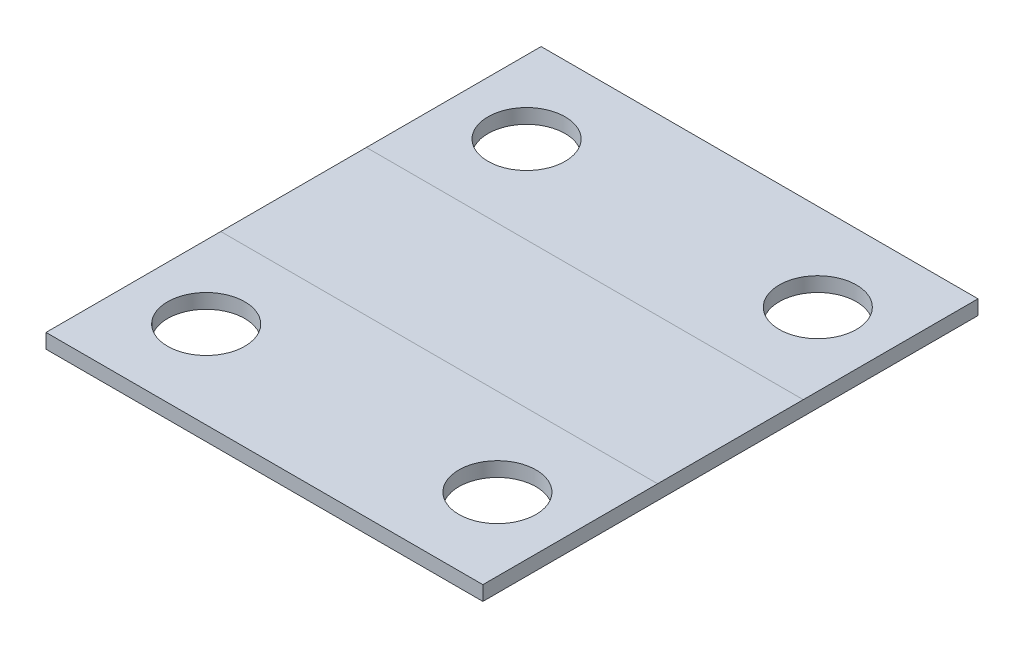
ISO-10303-21;
HEADER;
FILE_DESCRIPTION(('STEP AP214'),'2;1');
FILE_NAME('part.step','',(''),(''),'','','');
FILE_SCHEMA(('AUTOMOTIVE_DESIGN { 1 0 10303 214 1 1 1 1 }'));
ENDSEC;
DATA;
#1=APPLICATION_CONTEXT('core data for automotive mechanical design processes');
#2=APPLICATION_PROTOCOL_DEFINITION('international standard','automotive_design',2000,#1);
#3=PRODUCT_CONTEXT('',#1,'mechanical');
#4=PRODUCT('Part','Part','',(#3));
#5=PRODUCT_RELATED_PRODUCT_CATEGORY('part','',(#4));
#6=PRODUCT_DEFINITION_FORMATION('','',#4);
#7=PRODUCT_DEFINITION_CONTEXT('part definition',#1,'design');
#8=PRODUCT_DEFINITION('design','',#6,#7);
#9=PRODUCT_DEFINITION_SHAPE('','',#8);
#10=(LENGTH_UNIT() NAMED_UNIT(*) SI_UNIT(.MILLI.,.METRE.));
#11=(NAMED_UNIT(*) PLANE_ANGLE_UNIT() SI_UNIT($,.RADIAN.));
#12=(NAMED_UNIT(*) SI_UNIT($,.STERADIAN.) SOLID_ANGLE_UNIT());
#13=UNCERTAINTY_MEASURE_WITH_UNIT(LENGTH_MEASURE(1.E-05),#10,'distance_accuracy_value','');
#14=(GEOMETRIC_REPRESENTATION_CONTEXT(3) GLOBAL_UNCERTAINTY_ASSIGNED_CONTEXT((#13)) GLOBAL_UNIT_ASSIGNED_CONTEXT((#10,
#11,#12)) REPRESENTATION_CONTEXT('',''));
#15=CARTESIAN_POINT('',(0.,0.,0.));
#16=DIRECTION('',(0.,0.,1.));
#17=DIRECTION('',(1.,0.,0.));
#18=AXIS2_PLACEMENT_3D('',#15,#16,#17);
#19=CARTESIAN_POINT('',(0.,-0.5,0.));
#20=DIRECTION('',(0.,-1.,0.));
#21=DIRECTION('',(0.,0.,-1.));
#22=AXIS2_PLACEMENT_3D('',#19,#20,#21);
#23=PLANE('',#22);
#24=CARTESIAN_POINT('',(10.,-0.5,10.9999999999999));
#25=DIRECTION('',(0.,1.,0.));
#26=DIRECTION('',(0.,0.,1.));
#27=AXIS2_PLACEMENT_3D('',#24,#25,#26);
#28=CIRCLE('',#27,2.65);
#29=CARTESIAN_POINT('',(10.,-0.5,13.6499999999998));
#30=VERTEX_POINT('',#29);
#31=EDGE_CURVE('E195',#30,#30,#28,.T.);
#32=ORIENTED_EDGE('',*,*,#31,.T.);
#33=EDGE_LOOP('',(#32));
#34=FACE_BOUND('',#33,.T.);
#35=CARTESIAN_POINT('',(-10.,-0.5,10.9999999999999));
#36=DIRECTION('',(0.,1.,0.));
#37=DIRECTION('',(0.,0.,1.));
#38=AXIS2_PLACEMENT_3D('',#35,#36,#37);
#39=CIRCLE('',#38,2.65);
#40=CARTESIAN_POINT('',(-10.,-0.5,13.6499999999998));
#41=VERTEX_POINT('',#40);
#42=EDGE_CURVE('E201',#41,#41,#39,.T.);
#43=ORIENTED_EDGE('',*,*,#42,.T.);
#44=EDGE_LOOP('',(#43));
#45=FACE_BOUND('',#44,.T.);
#46=DIRECTION('',(0.,0.,1.));
#47=VECTOR('',#46,1.);
#48=CARTESIAN_POINT('',(-15.,-0.5,17.));
#49=LINE('',#48,#47);
#50=CARTESIAN_POINT('',(-15.,-0.5,5.));
#51=VERTEX_POINT('',#50);
#52=CARTESIAN_POINT('',(-15.,-0.5,17.));
#53=VERTEX_POINT('',#52);
#54=EDGE_CURVE('E138',#51,#53,#49,.T.);
#55=ORIENTED_EDGE('',*,*,#54,.F.);
#56=DIRECTION('',(1.,0.,0.));
#57=VECTOR('',#56,1.);
#58=CARTESIAN_POINT('',(0.,-0.5,5.));
#59=LINE('',#58,#57);
#60=CARTESIAN_POINT('',(15.,-0.5,5.));
#61=VERTEX_POINT('',#60);
#62=EDGE_CURVE('E11',#51,#61,#59,.T.);
#63=ORIENTED_EDGE('',*,*,#62,.T.);
#64=DIRECTION('',(0.,0.,-1.));
#65=VECTOR('',#64,1.);
#66=CARTESIAN_POINT('',(15.,-0.5,17.));
#67=LINE('',#66,#65);
#68=CARTESIAN_POINT('',(15.,-0.5,17.));
#69=VERTEX_POINT('',#68);
#70=EDGE_CURVE('E123',#69,#61,#67,.T.);
#71=ORIENTED_EDGE('',*,*,#70,.F.);
#72=DIRECTION('',(1.,0.,0.));
#73=VECTOR('',#72,1.);
#74=CARTESIAN_POINT('',(-15.,-0.5,17.));
#75=LINE('',#74,#73);
#76=EDGE_CURVE('E131',#53,#69,#75,.T.);
#77=ORIENTED_EDGE('',*,*,#76,.F.);
#78=EDGE_LOOP('',(#55,#63,#71,#77));
#79=FACE_BOUND('',#78,.T.);
#80=ADVANCED_FACE('F47',(#34,#45,#79),#23,.T.);
#81=CARTESIAN_POINT('',(0.,0.5,0.));
#82=DIRECTION('',(0.,-1.,0.));
#83=DIRECTION('',(0.,0.,-1.));
#84=AXIS2_PLACEMENT_3D('',#81,#82,#83);
#85=PLANE('',#84);
#86=CARTESIAN_POINT('',(-10.,0.500000000000001,10.9999999999999));
#87=DIRECTION('',(0.,1.,0.));
#88=DIRECTION('',(0.,0.,1.));
#89=AXIS2_PLACEMENT_3D('',#86,#87,#88);
#90=CIRCLE('',#89,2.64999999999999);
#91=CARTESIAN_POINT('',(-10.,0.500000000000001,13.6499999999998));
#92=VERTEX_POINT('',#91);
#93=EDGE_CURVE('E204',#92,#92,#90,.T.);
#94=ORIENTED_EDGE('',*,*,#93,.F.);
#95=EDGE_LOOP('',(#94));
#96=FACE_BOUND('',#95,.T.);
#97=CARTESIAN_POINT('',(10.,0.500000000000001,10.9999999999999));
#98=DIRECTION('',(0.,1.,0.));
#99=DIRECTION('',(0.,0.,1.));
#100=AXIS2_PLACEMENT_3D('',#97,#98,#99);
#101=CIRCLE('',#100,2.64999999999999);
#102=CARTESIAN_POINT('',(10.,0.500000000000001,13.6499999999998));
#103=VERTEX_POINT('',#102);
#104=EDGE_CURVE('E198',#103,#103,#101,.T.);
#105=ORIENTED_EDGE('',*,*,#104,.F.);
#106=EDGE_LOOP('',(#105));
#107=FACE_BOUND('',#106,.T.);
#108=DIRECTION('',(1.,0.,0.));
#109=VECTOR('',#108,1.);
#110=CARTESIAN_POINT('',(0.,0.5,5.));
#111=LINE('',#110,#109);
#112=CARTESIAN_POINT('',(-15.,0.5,5.));
#113=VERTEX_POINT('',#112);
#114=CARTESIAN_POINT('',(15.,0.5,5.));
#115=VERTEX_POINT('',#114);
#116=EDGE_CURVE('E51',#113,#115,#111,.T.);
#117=ORIENTED_EDGE('',*,*,#116,.F.);
#118=DIRECTION('',(0.,0.,1.));
#119=VECTOR('',#118,1.);
#120=CARTESIAN_POINT('',(-15.,0.5,17.));
#121=LINE('',#120,#119);
#122=CARTESIAN_POINT('',(-15.,0.5,17.));
#123=VERTEX_POINT('',#122);
#124=EDGE_CURVE('E152',#113,#123,#121,.T.);
#125=ORIENTED_EDGE('',*,*,#124,.T.);
#126=DIRECTION('',(1.,0.,0.));
#127=VECTOR('',#126,1.);
#128=CARTESIAN_POINT('',(-15.,0.5,17.));
#129=LINE('',#128,#127);
#130=CARTESIAN_POINT('',(15.,0.5,17.));
#131=VERTEX_POINT('',#130);
#132=EDGE_CURVE('E121',#123,#131,#129,.T.);
#133=ORIENTED_EDGE('',*,*,#132,.T.);
#134=DIRECTION('',(0.,0.,-1.));
#135=VECTOR('',#134,1.);
#136=CARTESIAN_POINT('',(15.,0.5,17.));
#137=LINE('',#136,#135);
#138=EDGE_CURVE('E146',#131,#115,#137,.T.);
#139=ORIENTED_EDGE('',*,*,#138,.T.);
#140=EDGE_LOOP('',(#117,#125,#133,#139));
#141=FACE_BOUND('',#140,.T.);
#142=ADVANCED_FACE('F210',(#96,#107,#141),#85,.F.);
#143=ORIENTED_EDGE('',*,*,#62,.F.);
#144=CARTESIAN_POINT('',(-15.,-0.5,-5.));
#145=VERTEX_POINT('',#144);
#146=EDGE_CURVE('E140',#145,#51,#49,.T.);
#147=ORIENTED_EDGE('',*,*,#146,.F.);
#148=DIRECTION('',(1.,0.,0.));
#149=VECTOR('',#148,1.);
#150=CARTESIAN_POINT('',(0.,-0.5,-5.));
#151=LINE('',#150,#149);
#152=CARTESIAN_POINT('',(15.,-0.5,-5.));
#153=VERTEX_POINT('',#152);
#154=EDGE_CURVE('E166',#145,#153,#151,.T.);
#155=ORIENTED_EDGE('',*,*,#154,.T.);
#156=EDGE_CURVE('E117',#61,#153,#67,.T.);
#157=ORIENTED_EDGE('',*,*,#156,.F.);
#158=EDGE_LOOP('',(#143,#147,#155,#157));
#159=FACE_BOUND('',#158,.T.);
#160=ADVANCED_FACE('F213',(#159),#23,.T.);
#161=CARTESIAN_POINT('',(-15.,0.5,-5.));
#162=VERTEX_POINT('',#161);
#163=EDGE_CURVE('E156',#162,#113,#121,.T.);
#164=ORIENTED_EDGE('',*,*,#163,.T.);
#165=ORIENTED_EDGE('',*,*,#116,.T.);
#166=CARTESIAN_POINT('',(15.,0.5,-5.));
#167=VERTEX_POINT('',#166);
#168=EDGE_CURVE('E149',#115,#167,#137,.T.);
#169=ORIENTED_EDGE('',*,*,#168,.T.);
#170=DIRECTION('',(1.,0.,0.));
#171=VECTOR('',#170,1.);
#172=CARTESIAN_POINT('',(0.,0.5,-5.));
#173=LINE('',#172,#171);
#174=EDGE_CURVE('E161',#162,#167,#173,.T.);
#175=ORIENTED_EDGE('',*,*,#174,.F.);
#176=EDGE_LOOP('',(#164,#165,#169,#175));
#177=FACE_BOUND('',#176,.T.);
#178=ADVANCED_FACE('F215',(#177),#85,.F.);
#179=CARTESIAN_POINT('',(15.,-0.5,17.));
#180=DIRECTION('',(1.,0.,0.));
#181=DIRECTION('',(0.,0.,-1.));
#182=AXIS2_PLACEMENT_3D('',#179,#180,#181);
#183=PLANE('',#182);
#184=ORIENTED_EDGE('',*,*,#138,.F.);
#185=DIRECTION('',(0.,1.,0.));
#186=VECTOR('',#185,1.);
#187=CARTESIAN_POINT('',(15.,-0.5,17.));
#188=LINE('',#187,#186);
#189=EDGE_CURVE('E159',#69,#131,#188,.T.);
#190=ORIENTED_EDGE('',*,*,#189,.F.);
#191=ORIENTED_EDGE('',*,*,#70,.T.);
#192=ORIENTED_EDGE('',*,*,#156,.T.);
#193=CARTESIAN_POINT('',(15.,-0.5,-17.));
#194=VERTEX_POINT('',#193);
#195=EDGE_CURVE('E110',#153,#194,#67,.T.);
#196=ORIENTED_EDGE('',*,*,#195,.T.);
#197=DIRECTION('',(0.,1.,0.));
#198=VECTOR('',#197,1.);
#199=CARTESIAN_POINT('',(15.,-0.5,-17.));
#200=LINE('',#199,#198);
#201=CARTESIAN_POINT('',(15.,0.5,-17.));
#202=VERTEX_POINT('',#201);
#203=EDGE_CURVE('E114',#194,#202,#200,.T.);
#204=ORIENTED_EDGE('',*,*,#203,.T.);
#205=EDGE_CURVE('E150',#167,#202,#137,.T.);
#206=ORIENTED_EDGE('',*,*,#205,.F.);
#207=ORIENTED_EDGE('',*,*,#168,.F.);
#208=EDGE_LOOP('',(#184,#190,#191,#192,#196,#204,#206,#207));
#209=FACE_BOUND('',#208,.T.);
#210=ADVANCED_FACE('F49',(#209),#183,.T.);
#211=CARTESIAN_POINT('',(-15.,-0.5,17.));
#212=DIRECTION('',(0.,0.,1.));
#213=DIRECTION('',(1.,0.,0.));
#214=AXIS2_PLACEMENT_3D('',#211,#212,#213);
#215=PLANE('',#214);
#216=ORIENTED_EDGE('',*,*,#132,.F.);
#217=DIRECTION('',(0.,1.,0.));
#218=VECTOR('',#217,1.);
#219=CARTESIAN_POINT('',(-15.,-0.5,17.));
#220=LINE('',#219,#218);
#221=EDGE_CURVE('E162',#53,#123,#220,.T.);
#222=ORIENTED_EDGE('',*,*,#221,.F.);
#223=ORIENTED_EDGE('',*,*,#76,.T.);
#224=ORIENTED_EDGE('',*,*,#189,.T.);
#225=EDGE_LOOP('',(#216,#222,#223,#224));
#226=FACE_BOUND('',#225,.T.);
#227=ADVANCED_FACE('F229',(#226),#215,.T.);
#228=CARTESIAN_POINT('',(-15.,-0.5,17.));
#229=DIRECTION('',(-1.,0.,0.));
#230=DIRECTION('',(0.,0.,1.));
#231=AXIS2_PLACEMENT_3D('',#228,#229,#230);
#232=PLANE('',#231);
#233=CARTESIAN_POINT('',(-15.,0.5,-17.));
#234=VERTEX_POINT('',#233);
#235=EDGE_CURVE('E153',#234,#162,#121,.T.);
#236=ORIENTED_EDGE('',*,*,#235,.F.);
#237=DIRECTION('',(0.,1.,0.));
#238=VECTOR('',#237,1.);
#239=CARTESIAN_POINT('',(-15.,-0.5,-17.));
#240=LINE('',#239,#238);
#241=CARTESIAN_POINT('',(-15.,-0.5,-17.));
#242=VERTEX_POINT('',#241);
#243=EDGE_CURVE('E130',#242,#234,#240,.T.);
#244=ORIENTED_EDGE('',*,*,#243,.F.);
#245=EDGE_CURVE('E137',#242,#145,#49,.T.);
#246=ORIENTED_EDGE('',*,*,#245,.T.);
#247=ORIENTED_EDGE('',*,*,#146,.T.);
#248=ORIENTED_EDGE('',*,*,#54,.T.);
#249=ORIENTED_EDGE('',*,*,#221,.T.);
#250=ORIENTED_EDGE('',*,*,#124,.F.);
#251=ORIENTED_EDGE('',*,*,#163,.F.);
#252=EDGE_LOOP('',(#236,#244,#246,#247,#248,#249,#250,#251));
#253=FACE_BOUND('',#252,.T.);
#254=ADVANCED_FACE('F220',(#253),#232,.T.);
#255=CARTESIAN_POINT('',(-15.,-0.5,-17.));
#256=DIRECTION('',(0.,0.,-1.));
#257=DIRECTION('',(-1.,0.,0.));
#258=AXIS2_PLACEMENT_3D('',#255,#256,#257);
#259=PLANE('',#258);
#260=DIRECTION('',(-1.,0.,0.));
#261=VECTOR('',#260,1.);
#262=CARTESIAN_POINT('',(-15.,0.5,-17.));
#263=LINE('',#262,#261);
#264=EDGE_CURVE('E129',#202,#234,#263,.T.);
#265=ORIENTED_EDGE('',*,*,#264,.F.);
#266=ORIENTED_EDGE('',*,*,#203,.F.);
#267=DIRECTION('',(-1.,0.,0.));
#268=VECTOR('',#267,1.);
#269=CARTESIAN_POINT('',(-15.,-0.5,-17.));
#270=LINE('',#269,#268);
#271=EDGE_CURVE('E127',#194,#242,#270,.T.);
#272=ORIENTED_EDGE('',*,*,#271,.T.);
#273=ORIENTED_EDGE('',*,*,#243,.T.);
#274=EDGE_LOOP('',(#265,#266,#272,#273));
#275=FACE_BOUND('',#274,.T.);
#276=ADVANCED_FACE('F126',(#275),#259,.T.);
#277=ORIENTED_EDGE('',*,*,#154,.F.);
#278=ORIENTED_EDGE('',*,*,#245,.F.);
#279=ORIENTED_EDGE('',*,*,#271,.F.);
#280=ORIENTED_EDGE('',*,*,#195,.F.);
#281=EDGE_LOOP('',(#277,#278,#279,#280));
#282=FACE_BOUND('',#281,.T.);
#283=CARTESIAN_POINT('',(-10.,-0.5,-11.));
#284=DIRECTION('',(0.,1.,0.));
#285=DIRECTION('',(0.,0.,1.));
#286=AXIS2_PLACEMENT_3D('',#283,#284,#285);
#287=CIRCLE('',#286,2.65);
#288=CARTESIAN_POINT('',(-10.,-0.5,-8.35));
#289=VERTEX_POINT('',#288);
#290=EDGE_CURVE('E187',#289,#289,#287,.T.);
#291=ORIENTED_EDGE('',*,*,#290,.T.);
#292=EDGE_LOOP('',(#291));
#293=FACE_BOUND('',#292,.T.);
#294=CARTESIAN_POINT('',(10.,-0.5,-11.));
#295=DIRECTION('',(0.,1.,0.));
#296=DIRECTION('',(0.,0.,1.));
#297=AXIS2_PLACEMENT_3D('',#294,#295,#296);
#298=CIRCLE('',#297,2.65);
#299=CARTESIAN_POINT('',(10.,-0.5,-8.35000000000001));
#300=VERTEX_POINT('',#299);
#301=EDGE_CURVE('E181',#300,#300,#298,.T.);
#302=ORIENTED_EDGE('',*,*,#301,.T.);
#303=EDGE_LOOP('',(#302));
#304=FACE_BOUND('',#303,.T.);
#305=ADVANCED_FACE('F134',(#282,#293,#304),#23,.T.);
#306=CARTESIAN_POINT('',(-10.,0.500000000000001,-11.));
#307=DIRECTION('',(0.,1.,0.));
#308=DIRECTION('',(0.,0.,1.));
#309=AXIS2_PLACEMENT_3D('',#306,#307,#308);
#310=CIRCLE('',#309,2.64999999999999);
#311=CARTESIAN_POINT('',(-10.,0.500000000000001,-8.35000000000002));
#312=VERTEX_POINT('',#311);
#313=EDGE_CURVE('E192',#312,#312,#310,.T.);
#314=ORIENTED_EDGE('',*,*,#313,.F.);
#315=EDGE_LOOP('',(#314));
#316=FACE_BOUND('',#315,.T.);
#317=CARTESIAN_POINT('',(10.,0.500000000000001,-11.));
#318=DIRECTION('',(0.,1.,0.));
#319=DIRECTION('',(0.,0.,1.));
#320=AXIS2_PLACEMENT_3D('',#317,#318,#319);
#321=CIRCLE('',#320,2.64999999999999);
#322=CARTESIAN_POINT('',(10.,0.500000000000001,-8.35000000000002));
#323=VERTEX_POINT('',#322);
#324=EDGE_CURVE('E183',#323,#323,#321,.T.);
#325=ORIENTED_EDGE('',*,*,#324,.F.);
#326=EDGE_LOOP('',(#325));
#327=FACE_BOUND('',#326,.T.);
#328=ORIENTED_EDGE('',*,*,#235,.T.);
#329=ORIENTED_EDGE('',*,*,#174,.T.);
#330=ORIENTED_EDGE('',*,*,#205,.T.);
#331=ORIENTED_EDGE('',*,*,#264,.T.);
#332=EDGE_LOOP('',(#328,#329,#330,#331));
#333=FACE_BOUND('',#332,.T.);
#334=ADVANCED_FACE('F175',(#316,#327,#333),#85,.F.);
#335=CARTESIAN_POINT('',(10.,0.5,-11.));
#336=DIRECTION('',(0.,1.,0.));
#337=DIRECTION('',(0.,0.,1.));
#338=AXIS2_PLACEMENT_3D('',#335,#336,#337);
#339=CYLINDRICAL_SURFACE('',#338,2.64999999999999);
#340=ORIENTED_EDGE('',*,*,#301,.F.);
#341=EDGE_LOOP('',(#340));
#342=FACE_BOUND('',#341,.T.);
#343=ORIENTED_EDGE('',*,*,#324,.T.);
#344=EDGE_LOOP('',(#343));
#345=FACE_BOUND('',#344,.T.);
#346=ADVANCED_FACE('F233',(#342,#345),#339,.F.);
#347=CARTESIAN_POINT('',(-10.,0.5,-11.));
#348=DIRECTION('',(0.,1.,0.));
#349=DIRECTION('',(0.,0.,1.));
#350=AXIS2_PLACEMENT_3D('',#347,#348,#349);
#351=CYLINDRICAL_SURFACE('',#350,2.64999999999999);
#352=ORIENTED_EDGE('',*,*,#290,.F.);
#353=EDGE_LOOP('',(#352));
#354=FACE_BOUND('',#353,.T.);
#355=ORIENTED_EDGE('',*,*,#313,.T.);
#356=EDGE_LOOP('',(#355));
#357=FACE_BOUND('',#356,.T.);
#358=ADVANCED_FACE('F282',(#354,#357),#351,.F.);
#359=CARTESIAN_POINT('',(10.,0.5,10.9999999999999));
#360=DIRECTION('',(0.,1.,0.));
#361=DIRECTION('',(0.,0.,1.));
#362=AXIS2_PLACEMENT_3D('',#359,#360,#361);
#363=CYLINDRICAL_SURFACE('',#362,2.64999999999999);
#364=ORIENTED_EDGE('',*,*,#31,.F.);
#365=EDGE_LOOP('',(#364));
#366=FACE_BOUND('',#365,.T.);
#367=ORIENTED_EDGE('',*,*,#104,.T.);
#368=EDGE_LOOP('',(#367));
#369=FACE_BOUND('',#368,.T.);
#370=ADVANCED_FACE('F292',(#366,#369),#363,.F.);
#371=CARTESIAN_POINT('',(-10.,0.5,10.9999999999999));
#372=DIRECTION('',(0.,1.,0.));
#373=DIRECTION('',(0.,0.,1.));
#374=AXIS2_PLACEMENT_3D('',#371,#372,#373);
#375=CYLINDRICAL_SURFACE('',#374,2.64999999999999);
#376=ORIENTED_EDGE('',*,*,#42,.F.);
#377=EDGE_LOOP('',(#376));
#378=FACE_BOUND('',#377,.T.);
#379=ORIENTED_EDGE('',*,*,#93,.T.);
#380=EDGE_LOOP('',(#379));
#381=FACE_BOUND('',#380,.T.);
#382=ADVANCED_FACE('F208',(#378,#381),#375,.F.);
#383=CLOSED_SHELL('',(#80,#142,#160,#178,#210,#227,#254,#276,#305,#334,#346,#358,#370,#382));
#384=MANIFOLD_SOLID_BREP('B2',#383);
#385=ADVANCED_BREP_SHAPE_REPRESENTATION('',(#18,#384),#14);
#386=SHAPE_DEFINITION_REPRESENTATION(#9,#385);
ENDSEC;
END-ISO-10303-21;
